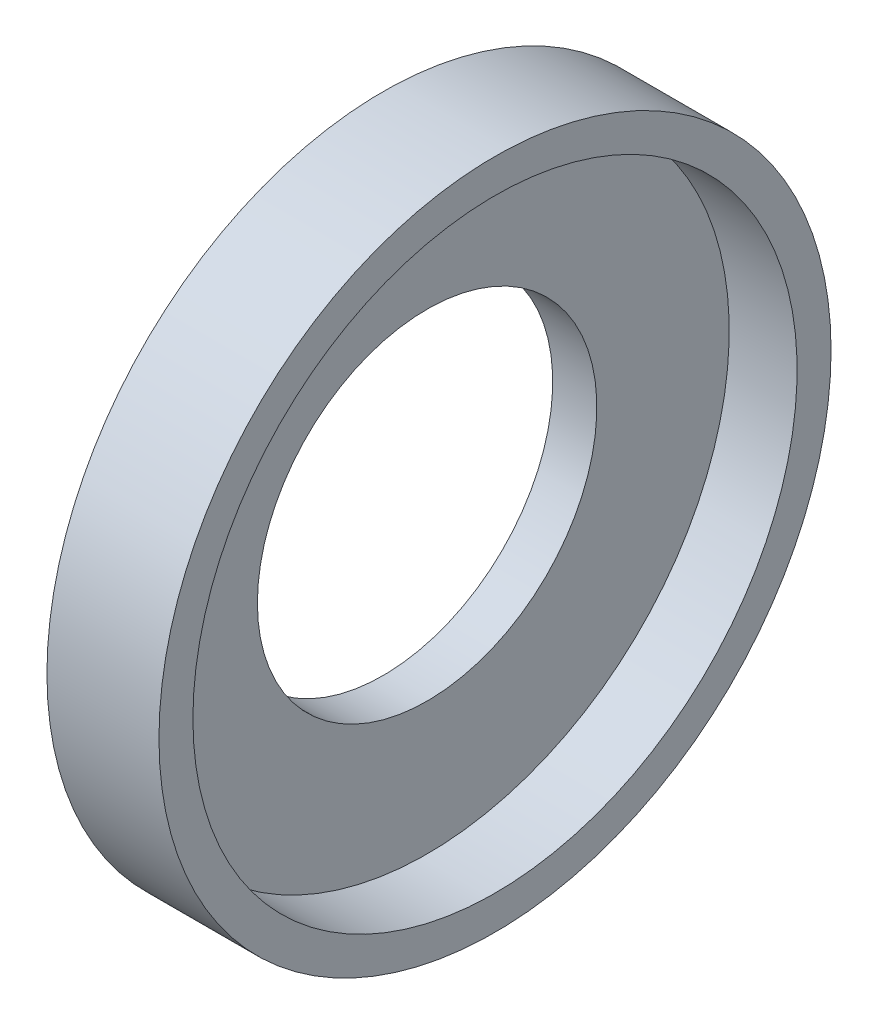
ISO-10303-21;
HEADER;
FILE_DESCRIPTION(('STEP AP214'),'2;1');
FILE_NAME('part.step','',(''),(''),'','','');
FILE_SCHEMA(('AUTOMOTIVE_DESIGN { 1 0 10303 214 1 1 1 1 }'));
ENDSEC;
DATA;
#1=APPLICATION_CONTEXT('core data for automotive mechanical design processes');
#2=APPLICATION_PROTOCOL_DEFINITION('international standard','automotive_design',2000,#1);
#3=PRODUCT_CONTEXT('',#1,'mechanical');
#4=PRODUCT('Part','Part','',(#3));
#5=PRODUCT_RELATED_PRODUCT_CATEGORY('part','',(#4));
#6=PRODUCT_DEFINITION_FORMATION('','',#4);
#7=PRODUCT_DEFINITION_CONTEXT('part definition',#1,'design');
#8=PRODUCT_DEFINITION('design','',#6,#7);
#9=PRODUCT_DEFINITION_SHAPE('','',#8);
#10=(LENGTH_UNIT() NAMED_UNIT(*) SI_UNIT(.MILLI.,.METRE.));
#11=(NAMED_UNIT(*) PLANE_ANGLE_UNIT() SI_UNIT($,.RADIAN.));
#12=(NAMED_UNIT(*) SI_UNIT($,.STERADIAN.) SOLID_ANGLE_UNIT());
#13=UNCERTAINTY_MEASURE_WITH_UNIT(LENGTH_MEASURE(1.E-05),#10,'distance_accuracy_value','');
#14=(GEOMETRIC_REPRESENTATION_CONTEXT(3) GLOBAL_UNCERTAINTY_ASSIGNED_CONTEXT((#13)) GLOBAL_UNIT_ASSIGNED_CONTEXT((#10,
#11,#12)) REPRESENTATION_CONTEXT('',''));
#15=CARTESIAN_POINT('',(0.,0.,0.));
#16=DIRECTION('',(0.,0.,1.));
#17=DIRECTION('',(1.,0.,0.));
#18=AXIS2_PLACEMENT_3D('',#15,#16,#17);
#19=CARTESIAN_POINT('',(10.03,0.,0.));
#20=DIRECTION('',(-1.,0.,0.));
#21=DIRECTION('',(0.,0.,1.));
#22=AXIS2_PLACEMENT_3D('',#19,#20,#21);
#23=CYLINDRICAL_SURFACE('',#22,4.45);
#24=CARTESIAN_POINT('',(9.53,0.,0.));
#25=DIRECTION('',(-1.,0.,0.));
#26=DIRECTION('',(0.,0.,1.));
#27=AXIS2_PLACEMENT_3D('',#24,#25,#26);
#28=CIRCLE('',#27,4.45);
#29=CARTESIAN_POINT('',(9.53,0.,4.45));
#30=VERTEX_POINT('',#29);
#31=EDGE_CURVE('E33',#30,#30,#28,.F.);
#32=ORIENTED_EDGE('',*,*,#31,.F.);
#33=EDGE_LOOP('',(#32));
#34=FACE_BOUND('',#33,.T.);
#35=CARTESIAN_POINT('',(10.53,0.,0.));
#36=DIRECTION('',(-1.,0.,0.));
#37=DIRECTION('',(0.,0.,1.));
#38=AXIS2_PLACEMENT_3D('',#35,#36,#37);
#39=CIRCLE('',#38,4.45);
#40=CARTESIAN_POINT('',(10.53,0.,4.45));
#41=VERTEX_POINT('',#40);
#42=EDGE_CURVE('E17',#41,#41,#39,.T.);
#43=ORIENTED_EDGE('',*,*,#42,.F.);
#44=EDGE_LOOP('',(#43));
#45=FACE_BOUND('',#44,.T.);
#46=ADVANCED_FACE('F14',(#34,#45),#23,.F.);
#47=CARTESIAN_POINT('',(10.53,4.7,0.));
#48=DIRECTION('',(1.,0.,0.));
#49=DIRECTION('',(0.,0.,-1.));
#50=AXIS2_PLACEMENT_3D('',#47,#48,#49);
#51=PLANE('',#50);
#52=CARTESIAN_POINT('',(10.53,0.,0.));
#53=DIRECTION('',(-1.,0.,0.));
#54=DIRECTION('',(0.,0.,1.));
#55=AXIS2_PLACEMENT_3D('',#52,#53,#54);
#56=CIRCLE('',#55,4.95);
#57=CARTESIAN_POINT('',(10.53,0.,4.95));
#58=VERTEX_POINT('',#57);
#59=EDGE_CURVE('E31',#58,#58,#56,.T.);
#60=ORIENTED_EDGE('',*,*,#59,.F.);
#61=EDGE_LOOP('',(#60));
#62=FACE_BOUND('',#61,.T.);
#63=ORIENTED_EDGE('',*,*,#42,.T.);
#64=EDGE_LOOP('',(#63));
#65=FACE_BOUND('',#64,.T.);
#66=ADVANCED_FACE('F40',(#62,#65),#51,.T.);
#67=CARTESIAN_POINT('',(9.53,3.475,0.));
#68=DIRECTION('',(1.,0.,0.));
#69=DIRECTION('',(0.,0.,-1.));
#70=AXIS2_PLACEMENT_3D('',#67,#68,#69);
#71=PLANE('',#70);
#72=ORIENTED_EDGE('',*,*,#31,.T.);
#73=EDGE_LOOP('',(#72));
#74=FACE_BOUND('',#73,.T.);
#75=CARTESIAN_POINT('',(9.53,0.,0.));
#76=DIRECTION('',(-1.,0.,0.));
#77=DIRECTION('',(0.,0.,1.));
#78=AXIS2_PLACEMENT_3D('',#75,#76,#77);
#79=CIRCLE('',#78,2.5);
#80=CARTESIAN_POINT('',(9.53,0.,2.5));
#81=VERTEX_POINT('',#80);
#82=EDGE_CURVE('E26',#81,#81,#79,.T.);
#83=ORIENTED_EDGE('',*,*,#82,.T.);
#84=EDGE_LOOP('',(#83));
#85=FACE_BOUND('',#84,.T.);
#86=ADVANCED_FACE('F48',(#74,#85),#71,.T.);
#87=CARTESIAN_POINT('',(9.705,0.,0.));
#88=DIRECTION('',(-1.,0.,0.));
#89=DIRECTION('',(0.,0.,1.));
#90=AXIS2_PLACEMENT_3D('',#87,#88,#89);
#91=CYLINDRICAL_SURFACE('',#90,4.95);
#92=ORIENTED_EDGE('',*,*,#59,.T.);
#93=EDGE_LOOP('',(#92));
#94=FACE_BOUND('',#93,.T.);
#95=CARTESIAN_POINT('',(8.88,0.,0.));
#96=DIRECTION('',(-1.,0.,0.));
#97=DIRECTION('',(0.,0.,1.));
#98=AXIS2_PLACEMENT_3D('',#95,#96,#97);
#99=CIRCLE('',#98,4.95);
#100=CARTESIAN_POINT('',(8.88,0.,4.95));
#101=VERTEX_POINT('',#100);
#102=EDGE_CURVE('E21',#101,#101,#99,.T.);
#103=ORIENTED_EDGE('',*,*,#102,.F.);
#104=EDGE_LOOP('',(#103));
#105=FACE_BOUND('',#104,.T.);
#106=ADVANCED_FACE('F57',(#94,#105),#91,.T.);
#107=CARTESIAN_POINT('',(9.205,0.,0.));
#108=DIRECTION('',(-1.,0.,0.));
#109=DIRECTION('',(0.,0.,1.));
#110=AXIS2_PLACEMENT_3D('',#107,#108,#109);
#111=CYLINDRICAL_SURFACE('',#110,2.5);
#112=CARTESIAN_POINT('',(8.88,0.,0.));
#113=DIRECTION('',(-1.,0.,0.));
#114=DIRECTION('',(0.,0.,1.));
#115=AXIS2_PLACEMENT_3D('',#112,#113,#114);
#116=CIRCLE('',#115,2.5);
#117=CARTESIAN_POINT('',(8.88,0.,2.5));
#118=VERTEX_POINT('',#117);
#119=EDGE_CURVE('E10',#118,#118,#116,.F.);
#120=ORIENTED_EDGE('',*,*,#119,.F.);
#121=EDGE_LOOP('',(#120));
#122=FACE_BOUND('',#121,.T.);
#123=ORIENTED_EDGE('',*,*,#82,.F.);
#124=EDGE_LOOP('',(#123));
#125=FACE_BOUND('',#124,.T.);
#126=ADVANCED_FACE('F52',(#122,#125),#111,.F.);
#127=CARTESIAN_POINT('',(8.88,3.725,0.));
#128=DIRECTION('',(-1.,0.,0.));
#129=DIRECTION('',(0.,0.,1.));
#130=AXIS2_PLACEMENT_3D('',#127,#128,#129);
#131=PLANE('',#130);
#132=ORIENTED_EDGE('',*,*,#119,.T.);
#133=EDGE_LOOP('',(#132));
#134=FACE_BOUND('',#133,.T.);
#135=ORIENTED_EDGE('',*,*,#102,.T.);
#136=EDGE_LOOP('',(#135));
#137=FACE_BOUND('',#136,.T.);
#138=ADVANCED_FACE('F50',(#134,#137),#131,.T.);
#139=CLOSED_SHELL('',(#46,#66,#86,#106,#126,#138));
#140=MANIFOLD_SOLID_BREP('B1',#139);
#141=ADVANCED_BREP_SHAPE_REPRESENTATION('',(#18,#140),#14);
#142=SHAPE_DEFINITION_REPRESENTATION(#9,#141);
ENDSEC;
END-ISO-10303-21;
